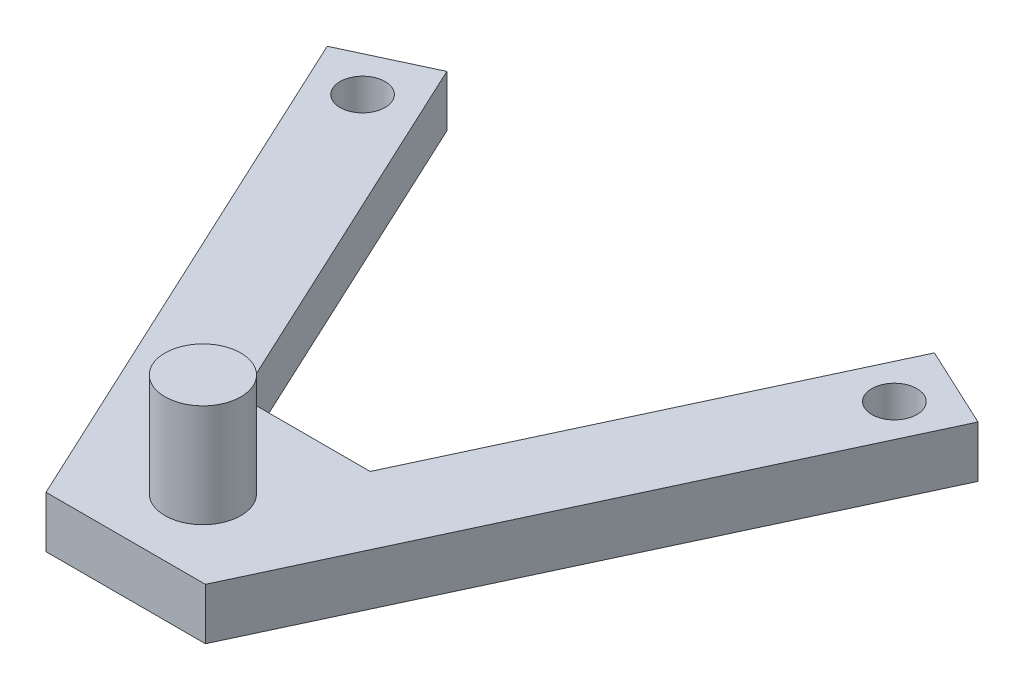
ISO-10303-21;
HEADER;
FILE_DESCRIPTION(('STEP AP214'),'2;1');
FILE_NAME('part.step','',(''),(''),'','','');
FILE_SCHEMA(('AUTOMOTIVE_DESIGN { 1 0 10303 214 1 1 1 1 }'));
ENDSEC;
DATA;
#1=APPLICATION_CONTEXT('core data for automotive mechanical design processes');
#2=APPLICATION_PROTOCOL_DEFINITION('international standard','automotive_design',2000,#1);
#3=PRODUCT_CONTEXT('',#1,'mechanical');
#4=PRODUCT('Part','Part','',(#3));
#5=PRODUCT_RELATED_PRODUCT_CATEGORY('part','',(#4));
#6=PRODUCT_DEFINITION_FORMATION('','',#4);
#7=PRODUCT_DEFINITION_CONTEXT('part definition',#1,'design');
#8=PRODUCT_DEFINITION('design','',#6,#7);
#9=PRODUCT_DEFINITION_SHAPE('','',#8);
#10=(LENGTH_UNIT() NAMED_UNIT(*) SI_UNIT(.MILLI.,.METRE.));
#11=(NAMED_UNIT(*) PLANE_ANGLE_UNIT() SI_UNIT($,.RADIAN.));
#12=(NAMED_UNIT(*) SI_UNIT($,.STERADIAN.) SOLID_ANGLE_UNIT());
#13=UNCERTAINTY_MEASURE_WITH_UNIT(LENGTH_MEASURE(1.E-05),#10,'distance_accuracy_value','');
#14=(GEOMETRIC_REPRESENTATION_CONTEXT(3) GLOBAL_UNCERTAINTY_ASSIGNED_CONTEXT((#13)) GLOBAL_UNIT_ASSIGNED_CONTEXT((#10,
#11,#12)) REPRESENTATION_CONTEXT('',''));
#15=CARTESIAN_POINT('',(0.,0.,0.));
#16=DIRECTION('',(0.,0.,1.));
#17=DIRECTION('',(1.,0.,0.));
#18=AXIS2_PLACEMENT_3D('',#15,#16,#17);
#19=CARTESIAN_POINT('',(0.,4.,0.));
#20=DIRECTION('',(0.,-1.,0.));
#21=DIRECTION('',(0.,0.,-1.));
#22=AXIS2_PLACEMENT_3D('',#19,#20,#21);
#23=PLANE('',#22);
#24=CARTESIAN_POINT('',(0.,4.,0.));
#25=DIRECTION('',(0.,1.,0.));
#26=DIRECTION('',(0.,0.,1.));
#27=AXIS2_PLACEMENT_3D('',#24,#25,#26);
#28=CIRCLE('',#27,2.95);
#29=CARTESIAN_POINT('',(0.,4.,2.95));
#30=VERTEX_POINT('',#29);
#31=EDGE_CURVE('E11',#30,#30,#28,.T.);
#32=ORIENTED_EDGE('',*,*,#31,.F.);
#33=EDGE_LOOP('',(#32));
#34=FACE_BOUND('',#33,.T.);
#35=DIRECTION('',(1.,0.,0.));
#36=VECTOR('',#35,1.);
#37=CARTESIAN_POINT('',(0.,4.,6.));
#38=LINE('',#37,#36);
#39=CARTESIAN_POINT('',(-6.19533821856756,4.,6.));
#40=VERTEX_POINT('',#39);
#41=CARTESIAN_POINT('',(6.19533821856756,4.,6.));
#42=VERTEX_POINT('',#41);
#43=EDGE_CURVE('E136',#40,#42,#38,.T.);
#44=ORIENTED_EDGE('',*,*,#43,.T.);
#45=DIRECTION('',(-0.422618261740693,0.,0.906307787036653));
#46=VECTOR('',#45,1.);
#47=CARTESIAN_POINT('',(7.38694576099708,4.,3.44458937872848));
#48=LINE('',#47,#46);
#49=CARTESIAN_POINT('',(25.2905571466995,4.,-34.9498291400247));
#50=VERTEX_POINT('',#49);
#51=EDGE_CURVE('E49',#50,#42,#48,.T.);
#52=ORIENTED_EDGE('',*,*,#51,.F.);
#53=DIRECTION('',(0.906307787036653,0.,0.422618261740692));
#54=VECTOR('',#53,1.);
#55=CARTESIAN_POINT('',(17.9036113857023,4.,-38.3944185187532));
#56=LINE('',#55,#54);
#57=CARTESIAN_POINT('',(18.9464026374429,4.,-37.9081569722095));
#58=VERTEX_POINT('',#57);
#59=EDGE_CURVE('E116',#58,#50,#56,.T.);
#60=ORIENTED_EDGE('',*,*,#59,.F.);
#61=DIRECTION('',(-0.422618261740694,0.,0.906307787036653));
#62=VECTOR('',#61,1.);
#63=CARTESIAN_POINT('',(1.0427912517405,4.,0.486261546543623));
#64=LINE('',#63,#62);
#65=CARTESIAN_POINT('',(5.,4.,-8.));
#66=VERTEX_POINT('',#65);
#67=EDGE_CURVE('E119',#58,#66,#64,.T.);
#68=ORIENTED_EDGE('',*,*,#67,.T.);
#69=DIRECTION('',(1.,0.,0.));
#70=VECTOR('',#69,1.);
#71=CARTESIAN_POINT('',(0.,4.,-8.));
#72=LINE('',#71,#70);
#73=CARTESIAN_POINT('',(-5.,4.,-8.));
#74=VERTEX_POINT('',#73);
#75=EDGE_CURVE('E148',#74,#66,#72,.T.);
#76=ORIENTED_EDGE('',*,*,#75,.F.);
#77=DIRECTION('',(0.422618261740694,0.,0.906307787036653));
#78=VECTOR('',#77,1.);
#79=CARTESIAN_POINT('',(-1.0427912517405,4.,0.486261546543623));
#80=LINE('',#79,#78);
#81=CARTESIAN_POINT('',(-18.9464026374429,4.,-37.9081569722095));
#82=VERTEX_POINT('',#81);
#83=EDGE_CURVE('E145',#82,#74,#80,.T.);
#84=ORIENTED_EDGE('',*,*,#83,.F.);
#85=DIRECTION('',(-0.906307787036653,0.,0.422618261740692));
#86=VECTOR('',#85,1.);
#87=CARTESIAN_POINT('',(-17.9036113857023,4.,-38.3944185187532));
#88=LINE('',#87,#86);
#89=CARTESIAN_POINT('',(-25.2905571466995,4.,-34.9498291400247));
#90=VERTEX_POINT('',#89);
#91=EDGE_CURVE('E142',#82,#90,#88,.T.);
#92=ORIENTED_EDGE('',*,*,#91,.T.);
#93=DIRECTION('',(0.422618261740693,0.,0.906307787036653));
#94=VECTOR('',#93,1.);
#95=CARTESIAN_POINT('',(-7.38694576099708,4.,3.44458937872848));
#96=LINE('',#95,#94);
#97=EDGE_CURVE('E139',#90,#40,#96,.T.);
#98=ORIENTED_EDGE('',*,*,#97,.T.);
#99=EDGE_LOOP('',(#44,#52,#60,#68,#76,#84,#92,#98));
#100=FACE_BOUND('',#99,.T.);
#101=CARTESIAN_POINT('',(20.666851305095,4.,-33.0738757501006));
#102=DIRECTION('',(0.,1.,0.));
#103=DIRECTION('',(0.,0.,1.));
#104=AXIS2_PLACEMENT_3D('',#101,#102,#103);
#105=CIRCLE('',#104,1.75);
#106=CARTESIAN_POINT('',(20.666851305095,4.,-31.3238757501006));
#107=VERTEX_POINT('',#106);
#108=EDGE_CURVE('E41',#107,#107,#105,.T.);
#109=ORIENTED_EDGE('',*,*,#108,.F.);
#110=EDGE_LOOP('',(#109));
#111=FACE_BOUND('',#110,.T.);
#112=CARTESIAN_POINT('',(-20.666851305095,4.,-33.0738757501006));
#113=DIRECTION('',(0.,1.,0.));
#114=DIRECTION('',(0.,0.,-1.));
#115=AXIS2_PLACEMENT_3D('',#112,#113,#114);
#116=CIRCLE('',#115,1.75);
#117=CARTESIAN_POINT('',(-20.666851305095,4.,-34.8238757501006));
#118=VERTEX_POINT('',#117);
#119=EDGE_CURVE('E170',#118,#118,#116,.T.);
#120=ORIENTED_EDGE('',*,*,#119,.F.);
#121=EDGE_LOOP('',(#120));
#122=FACE_BOUND('',#121,.T.);
#123=ADVANCED_FACE('F32',(#34,#100,#111,#122),#23,.F.);
#124=CARTESIAN_POINT('',(0.,0.,0.));
#125=DIRECTION('',(0.,-1.,0.));
#126=DIRECTION('',(0.,0.,-1.));
#127=AXIS2_PLACEMENT_3D('',#124,#125,#126);
#128=PLANE('',#127);
#129=DIRECTION('',(-0.422618261740693,0.,0.906307787036653));
#130=VECTOR('',#129,1.);
#131=CARTESIAN_POINT('',(7.38694576099708,0.,3.44458937872848));
#132=LINE('',#131,#130);
#133=CARTESIAN_POINT('',(25.2905571466995,0.,-34.9498291400247));
#134=VERTEX_POINT('',#133);
#135=CARTESIAN_POINT('',(6.19533821856756,0.,6.));
#136=VERTEX_POINT('',#135);
#137=EDGE_CURVE('E106',#134,#136,#132,.T.);
#138=ORIENTED_EDGE('',*,*,#137,.T.);
#139=DIRECTION('',(1.,0.,0.));
#140=VECTOR('',#139,1.);
#141=CARTESIAN_POINT('',(0.,0.,6.));
#142=LINE('',#141,#140);
#143=CARTESIAN_POINT('',(-6.19533821856756,0.,6.));
#144=VERTEX_POINT('',#143);
#145=EDGE_CURVE('E98',#144,#136,#142,.T.);
#146=ORIENTED_EDGE('',*,*,#145,.F.);
#147=DIRECTION('',(0.422618261740693,0.,0.906307787036653));
#148=VECTOR('',#147,1.);
#149=CARTESIAN_POINT('',(-7.38694576099708,0.,3.44458937872848));
#150=LINE('',#149,#148);
#151=CARTESIAN_POINT('',(-25.2905571466995,0.,-34.9498291400247));
#152=VERTEX_POINT('',#151);
#153=EDGE_CURVE('E105',#152,#144,#150,.T.);
#154=ORIENTED_EDGE('',*,*,#153,.F.);
#155=DIRECTION('',(-0.906307787036653,0.,0.422618261740692));
#156=VECTOR('',#155,1.);
#157=CARTESIAN_POINT('',(-17.9036113857023,0.,-38.3944185187532));
#158=LINE('',#157,#156);
#159=CARTESIAN_POINT('',(-18.9464026374429,0.,-37.9081569722095));
#160=VERTEX_POINT('',#159);
#161=EDGE_CURVE('E124',#160,#152,#158,.T.);
#162=ORIENTED_EDGE('',*,*,#161,.F.);
#163=DIRECTION('',(0.422618261740694,0.,0.906307787036653));
#164=VECTOR('',#163,1.);
#165=CARTESIAN_POINT('',(-1.0427912517405,0.,0.486261546543623));
#166=LINE('',#165,#164);
#167=CARTESIAN_POINT('',(-5.,0.,-8.));
#168=VERTEX_POINT('',#167);
#169=EDGE_CURVE('E126',#160,#168,#166,.T.);
#170=ORIENTED_EDGE('',*,*,#169,.T.);
#171=DIRECTION('',(1.,0.,0.));
#172=VECTOR('',#171,1.);
#173=CARTESIAN_POINT('',(0.,0.,-8.));
#174=LINE('',#173,#172);
#175=CARTESIAN_POINT('',(5.,0.,-8.));
#176=VERTEX_POINT('',#175);
#177=EDGE_CURVE('E129',#168,#176,#174,.T.);
#178=ORIENTED_EDGE('',*,*,#177,.T.);
#179=DIRECTION('',(-0.422618261740694,0.,0.906307787036653));
#180=VECTOR('',#179,1.);
#181=CARTESIAN_POINT('',(1.0427912517405,0.,0.486261546543623));
#182=LINE('',#181,#180);
#183=CARTESIAN_POINT('',(18.9464026374429,0.,-37.9081569722095));
#184=VERTEX_POINT('',#183);
#185=EDGE_CURVE('E132',#184,#176,#182,.T.);
#186=ORIENTED_EDGE('',*,*,#185,.F.);
#187=DIRECTION('',(0.906307787036653,0.,0.422618261740692));
#188=VECTOR('',#187,1.);
#189=CARTESIAN_POINT('',(17.9036113857023,0.,-38.3944185187532));
#190=LINE('',#189,#188);
#191=EDGE_CURVE('E111',#184,#134,#190,.T.);
#192=ORIENTED_EDGE('',*,*,#191,.T.);
#193=EDGE_LOOP('',(#138,#146,#154,#162,#170,#178,#186,#192));
#194=FACE_BOUND('',#193,.T.);
#195=CARTESIAN_POINT('',(20.666851305095,0.,-33.0738757501006));
#196=DIRECTION('',(0.,-1.,0.));
#197=DIRECTION('',(0.,0.,-1.));
#198=AXIS2_PLACEMENT_3D('',#195,#196,#197);
#199=CIRCLE('',#198,1.75);
#200=CARTESIAN_POINT('',(20.666851305095,0.,-34.8238757501006));
#201=VERTEX_POINT('',#200);
#202=EDGE_CURVE('E168',#201,#201,#199,.F.);
#203=ORIENTED_EDGE('',*,*,#202,.T.);
#204=EDGE_LOOP('',(#203));
#205=FACE_BOUND('',#204,.T.);
#206=CARTESIAN_POINT('',(-20.666851305095,0.,-33.0738757501006));
#207=DIRECTION('',(0.,-1.,0.));
#208=DIRECTION('',(0.,0.,-1.));
#209=AXIS2_PLACEMENT_3D('',#206,#207,#208);
#210=CIRCLE('',#209,1.75);
#211=CARTESIAN_POINT('',(-20.666851305095,0.,-34.8238757501006));
#212=VERTEX_POINT('',#211);
#213=EDGE_CURVE('E36',#212,#212,#210,.F.);
#214=ORIENTED_EDGE('',*,*,#213,.T.);
#215=EDGE_LOOP('',(#214));
#216=FACE_BOUND('',#215,.T.);
#217=ADVANCED_FACE('F34',(#194,#205,#216),#128,.T.);
#218=CARTESIAN_POINT('',(-20.666851305095,-0.00100000000000013,-33.0738757501006));
#219=DIRECTION('',(0.,1.,0.));
#220=DIRECTION('',(0.,0.,1.));
#221=AXIS2_PLACEMENT_3D('',#218,#219,#220);
#222=CYLINDRICAL_SURFACE('',#221,1.75);
#223=ORIENTED_EDGE('',*,*,#213,.F.);
#224=EDGE_LOOP('',(#223));
#225=FACE_BOUND('',#224,.T.);
#226=ORIENTED_EDGE('',*,*,#119,.T.);
#227=EDGE_LOOP('',(#226));
#228=FACE_BOUND('',#227,.T.);
#229=ADVANCED_FACE('F178',(#225,#228),#222,.F.);
#230=CARTESIAN_POINT('',(20.666851305095,-0.00100000000000013,-33.0738757501006));
#231=DIRECTION('',(0.,1.,0.));
#232=DIRECTION('',(0.,0.,1.));
#233=AXIS2_PLACEMENT_3D('',#230,#231,#232);
#234=CYLINDRICAL_SURFACE('',#233,1.75);
#235=ORIENTED_EDGE('',*,*,#202,.F.);
#236=EDGE_LOOP('',(#235));
#237=FACE_BOUND('',#236,.T.);
#238=ORIENTED_EDGE('',*,*,#108,.T.);
#239=EDGE_LOOP('',(#238));
#240=FACE_BOUND('',#239,.T.);
#241=ADVANCED_FACE('F180',(#237,#240),#234,.F.);
#242=CARTESIAN_POINT('',(7.38694576099708,0.,3.44458937872848));
#243=DIRECTION('',(-0.906307787036653,0.,-0.422618261740693));
#244=DIRECTION('',(-0.422618261740693,0.,0.906307787036653));
#245=AXIS2_PLACEMENT_3D('',#242,#243,#244);
#246=PLANE('',#245);
#247=ORIENTED_EDGE('',*,*,#51,.T.);
#248=DIRECTION('',(0.,1.,0.));
#249=VECTOR('',#248,1.);
#250=CARTESIAN_POINT('',(6.19533821856756,0.,6.));
#251=LINE('',#250,#249);
#252=EDGE_CURVE('E100',#136,#42,#251,.T.);
#253=ORIENTED_EDGE('',*,*,#252,.F.);
#254=ORIENTED_EDGE('',*,*,#137,.F.);
#255=DIRECTION('',(0.,1.,0.));
#256=VECTOR('',#255,1.);
#257=CARTESIAN_POINT('',(25.2905571466995,0.,-34.9498291400247));
#258=LINE('',#257,#256);
#259=EDGE_CURVE('E153',#134,#50,#258,.T.);
#260=ORIENTED_EDGE('',*,*,#259,.T.);
#261=EDGE_LOOP('',(#247,#253,#254,#260));
#262=FACE_BOUND('',#261,.T.);
#263=ADVANCED_FACE('F109',(#262),#246,.F.);
#264=CARTESIAN_POINT('',(17.9036113857023,0.,-38.3944185187532));
#265=DIRECTION('',(-0.422618261740692,0.,0.906307787036653));
#266=DIRECTION('',(0.906307787036653,0.,0.422618261740692));
#267=AXIS2_PLACEMENT_3D('',#264,#265,#266);
#268=PLANE('',#267);
#269=ORIENTED_EDGE('',*,*,#59,.T.);
#270=ORIENTED_EDGE('',*,*,#259,.F.);
#271=ORIENTED_EDGE('',*,*,#191,.F.);
#272=DIRECTION('',(0.,1.,0.));
#273=VECTOR('',#272,1.);
#274=CARTESIAN_POINT('',(18.9464026374429,0.,-37.9081569722095));
#275=LINE('',#274,#273);
#276=EDGE_CURVE('E155',#184,#58,#275,.T.);
#277=ORIENTED_EDGE('',*,*,#276,.T.);
#278=EDGE_LOOP('',(#269,#270,#271,#277));
#279=FACE_BOUND('',#278,.T.);
#280=ADVANCED_FACE('F220',(#279),#268,.F.);
#281=CARTESIAN_POINT('',(1.0427912517405,0.,0.486261546543623));
#282=DIRECTION('',(-0.906307787036653,0.,-0.422618261740694));
#283=DIRECTION('',(-0.422618261740694,0.,0.906307787036653));
#284=AXIS2_PLACEMENT_3D('',#281,#282,#283);
#285=PLANE('',#284);
#286=ORIENTED_EDGE('',*,*,#67,.F.);
#287=ORIENTED_EDGE('',*,*,#276,.F.);
#288=ORIENTED_EDGE('',*,*,#185,.T.);
#289=DIRECTION('',(0.,1.,0.));
#290=VECTOR('',#289,1.);
#291=CARTESIAN_POINT('',(5.,0.,-8.));
#292=LINE('',#291,#290);
#293=EDGE_CURVE('E157',#176,#66,#292,.T.);
#294=ORIENTED_EDGE('',*,*,#293,.T.);
#295=EDGE_LOOP('',(#286,#287,#288,#294));
#296=FACE_BOUND('',#295,.T.);
#297=ADVANCED_FACE('F218',(#296),#285,.T.);
#298=CARTESIAN_POINT('',(0.,0.,-8.));
#299=DIRECTION('',(0.,0.,1.));
#300=DIRECTION('',(1.,0.,0.));
#301=AXIS2_PLACEMENT_3D('',#298,#299,#300);
#302=PLANE('',#301);
#303=ORIENTED_EDGE('',*,*,#75,.T.);
#304=ORIENTED_EDGE('',*,*,#293,.F.);
#305=ORIENTED_EDGE('',*,*,#177,.F.);
#306=DIRECTION('',(0.,1.,0.));
#307=VECTOR('',#306,1.);
#308=CARTESIAN_POINT('',(-5.,0.,-8.));
#309=LINE('',#308,#307);
#310=EDGE_CURVE('E159',#168,#74,#309,.T.);
#311=ORIENTED_EDGE('',*,*,#310,.T.);
#312=EDGE_LOOP('',(#303,#304,#305,#311));
#313=FACE_BOUND('',#312,.T.);
#314=ADVANCED_FACE('F215',(#313),#302,.F.);
#315=CARTESIAN_POINT('',(-1.0427912517405,0.,0.486261546543623));
#316=DIRECTION('',(-0.906307787036653,0.,0.422618261740694));
#317=DIRECTION('',(0.422618261740694,0.,0.906307787036653));
#318=AXIS2_PLACEMENT_3D('',#315,#316,#317);
#319=PLANE('',#318);
#320=ORIENTED_EDGE('',*,*,#83,.T.);
#321=ORIENTED_EDGE('',*,*,#310,.F.);
#322=ORIENTED_EDGE('',*,*,#169,.F.);
#323=DIRECTION('',(0.,1.,0.));
#324=VECTOR('',#323,1.);
#325=CARTESIAN_POINT('',(-18.9464026374429,0.,-37.9081569722095));
#326=LINE('',#325,#324);
#327=EDGE_CURVE('E161',#160,#82,#326,.T.);
#328=ORIENTED_EDGE('',*,*,#327,.T.);
#329=EDGE_LOOP('',(#320,#321,#322,#328));
#330=FACE_BOUND('',#329,.T.);
#331=ADVANCED_FACE('F210',(#330),#319,.F.);
#332=CARTESIAN_POINT('',(-17.9036113857023,0.,-38.3944185187532));
#333=DIRECTION('',(-0.422618261740692,0.,-0.906307787036653));
#334=DIRECTION('',(-0.906307787036653,0.,0.422618261740692));
#335=AXIS2_PLACEMENT_3D('',#332,#333,#334);
#336=PLANE('',#335);
#337=ORIENTED_EDGE('',*,*,#91,.F.);
#338=ORIENTED_EDGE('',*,*,#327,.F.);
#339=ORIENTED_EDGE('',*,*,#161,.T.);
#340=DIRECTION('',(0.,1.,0.));
#341=VECTOR('',#340,1.);
#342=CARTESIAN_POINT('',(-25.2905571466995,0.,-34.9498291400247));
#343=LINE('',#342,#341);
#344=EDGE_CURVE('E163',#152,#90,#343,.T.);
#345=ORIENTED_EDGE('',*,*,#344,.T.);
#346=EDGE_LOOP('',(#337,#338,#339,#345));
#347=FACE_BOUND('',#346,.T.);
#348=ADVANCED_FACE('F208',(#347),#336,.T.);
#349=CARTESIAN_POINT('',(-7.38694576099708,0.,3.44458937872848));
#350=DIRECTION('',(-0.906307787036653,0.,0.422618261740693));
#351=DIRECTION('',(0.422618261740693,0.,0.906307787036653));
#352=AXIS2_PLACEMENT_3D('',#349,#350,#351);
#353=PLANE('',#352);
#354=ORIENTED_EDGE('',*,*,#97,.F.);
#355=ORIENTED_EDGE('',*,*,#344,.F.);
#356=ORIENTED_EDGE('',*,*,#153,.T.);
#357=DIRECTION('',(0.,1.,0.));
#358=VECTOR('',#357,1.);
#359=CARTESIAN_POINT('',(-6.19533821856756,0.,6.));
#360=LINE('',#359,#358);
#361=EDGE_CURVE('E57',#144,#40,#360,.T.);
#362=ORIENTED_EDGE('',*,*,#361,.T.);
#363=EDGE_LOOP('',(#354,#355,#356,#362));
#364=FACE_BOUND('',#363,.T.);
#365=ADVANCED_FACE('F204',(#364),#353,.T.);
#366=CARTESIAN_POINT('',(0.,0.,6.));
#367=DIRECTION('',(0.,0.,1.));
#368=DIRECTION('',(1.,0.,0.));
#369=AXIS2_PLACEMENT_3D('',#366,#367,#368);
#370=PLANE('',#369);
#371=ORIENTED_EDGE('',*,*,#43,.F.);
#372=ORIENTED_EDGE('',*,*,#361,.F.);
#373=ORIENTED_EDGE('',*,*,#145,.T.);
#374=ORIENTED_EDGE('',*,*,#252,.T.);
#375=EDGE_LOOP('',(#371,#372,#373,#374));
#376=FACE_BOUND('',#375,.T.);
#377=ADVANCED_FACE('F99',(#376),#370,.T.);
#378=CARTESIAN_POINT('',(0.,12.,0.));
#379=DIRECTION('',(0.,-1.,0.));
#380=DIRECTION('',(0.,0.,-1.));
#381=AXIS2_PLACEMENT_3D('',#378,#379,#380);
#382=CYLINDRICAL_SURFACE('',#381,2.95);
#383=CARTESIAN_POINT('',(0.,12.,0.));
#384=DIRECTION('',(0.,1.,0.));
#385=DIRECTION('',(0.,0.,1.));
#386=AXIS2_PLACEMENT_3D('',#383,#384,#385);
#387=CIRCLE('',#386,2.95);
#388=CARTESIAN_POINT('',(0.,12.,2.95));
#389=VERTEX_POINT('',#388);
#390=EDGE_CURVE('E137',#389,#389,#387,.T.);
#391=ORIENTED_EDGE('',*,*,#390,.F.);
#392=EDGE_LOOP('',(#391));
#393=FACE_BOUND('',#392,.T.);
#394=ORIENTED_EDGE('',*,*,#31,.T.);
#395=EDGE_LOOP('',(#394));
#396=FACE_BOUND('',#395,.T.);
#397=ADVANCED_FACE('F230',(#393,#396),#382,.T.);
#398=CARTESIAN_POINT('',(0.,12.,0.));
#399=DIRECTION('',(0.,1.,0.));
#400=DIRECTION('',(0.,0.,1.));
#401=AXIS2_PLACEMENT_3D('',#398,#399,#400);
#402=PLANE('',#401);
#403=ORIENTED_EDGE('',*,*,#390,.T.);
#404=EDGE_LOOP('',(#403));
#405=FACE_BOUND('',#404,.T.);
#406=ADVANCED_FACE('F245',(#405),#402,.T.);
#407=CLOSED_SHELL('',(#123,#217,#229,#241,#263,#280,#297,#314,#331,#348,#365,#377,#397,#406));
#408=MANIFOLD_SOLID_BREP('B2',#407);
#409=ADVANCED_BREP_SHAPE_REPRESENTATION('',(#18,#408),#14);
#410=SHAPE_DEFINITION_REPRESENTATION(#9,#409);
ENDSEC;
END-ISO-10303-21;
